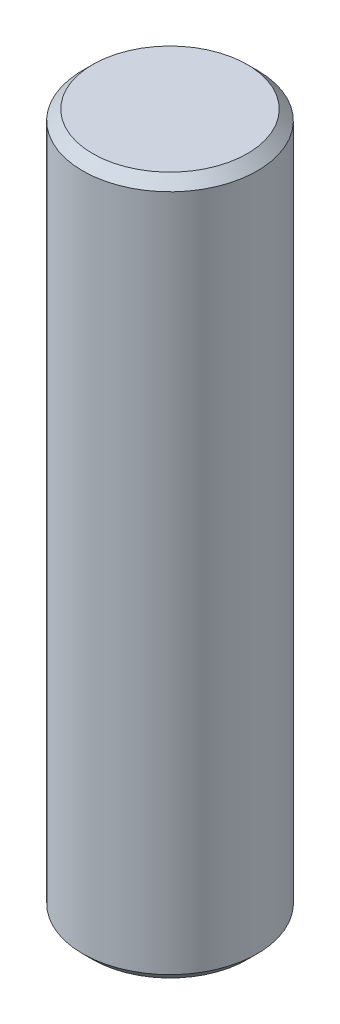
ISO-10303-21;
HEADER;
FILE_DESCRIPTION(('STEP AP214'),'2;1');
FILE_NAME('part.step','',(''),(''),'','','');
FILE_SCHEMA(('AUTOMOTIVE_DESIGN { 1 0 10303 214 1 1 1 1 }'));
ENDSEC;
DATA;
#1=APPLICATION_CONTEXT('core data for automotive mechanical design processes');
#2=APPLICATION_PROTOCOL_DEFINITION('international standard','automotive_design',2000,#1);
#3=PRODUCT_CONTEXT('',#1,'mechanical');
#4=PRODUCT('Part','Part','',(#3));
#5=PRODUCT_RELATED_PRODUCT_CATEGORY('part','',(#4));
#6=PRODUCT_DEFINITION_FORMATION('','',#4);
#7=PRODUCT_DEFINITION_CONTEXT('part definition',#1,'design');
#8=PRODUCT_DEFINITION('design','',#6,#7);
#9=PRODUCT_DEFINITION_SHAPE('','',#8);
#10=(LENGTH_UNIT() NAMED_UNIT(*) SI_UNIT(.MILLI.,.METRE.));
#11=(NAMED_UNIT(*) PLANE_ANGLE_UNIT() SI_UNIT($,.RADIAN.));
#12=(NAMED_UNIT(*) SI_UNIT($,.STERADIAN.) SOLID_ANGLE_UNIT());
#13=UNCERTAINTY_MEASURE_WITH_UNIT(LENGTH_MEASURE(1.E-05),#10,'distance_accuracy_value','');
#14=(GEOMETRIC_REPRESENTATION_CONTEXT(3) GLOBAL_UNCERTAINTY_ASSIGNED_CONTEXT((#13)) GLOBAL_UNIT_ASSIGNED_CONTEXT((#10,
#11,#12)) REPRESENTATION_CONTEXT('',''));
#15=CARTESIAN_POINT('',(0.,0.,0.));
#16=DIRECTION('',(0.,0.,1.));
#17=DIRECTION('',(1.,0.,0.));
#18=AXIS2_PLACEMENT_3D('',#15,#16,#17);
#19=CARTESIAN_POINT('',(0.,14.,0.));
#20=DIRECTION('',(0.,-1.,0.));
#21=DIRECTION('',(0.,0.,-1.));
#22=AXIS2_PLACEMENT_3D('',#19,#20,#21);
#23=CYLINDRICAL_SURFACE('',#22,1.75);
#24=CARTESIAN_POINT('',(0.,0.200000000000002,0.));
#25=DIRECTION('',(0.,1.,0.));
#26=DIRECTION('',(0.,0.,1.));
#27=AXIS2_PLACEMENT_3D('',#24,#25,#26);
#28=CIRCLE('',#27,1.75);
#29=CARTESIAN_POINT('',(0.,0.200000000000002,1.75));
#30=VERTEX_POINT('',#29);
#31=EDGE_CURVE('E46',#30,#30,#28,.T.);
#32=ORIENTED_EDGE('',*,*,#31,.T.);
#33=EDGE_LOOP('',(#32));
#34=FACE_BOUND('',#33,.T.);
#35=CARTESIAN_POINT('',(0.,13.8,0.));
#36=DIRECTION('',(0.,1.,0.));
#37=DIRECTION('',(0.,0.,1.));
#38=AXIS2_PLACEMENT_3D('',#35,#36,#37);
#39=CIRCLE('',#38,1.75);
#40=CARTESIAN_POINT('',(0.,13.8,1.75));
#41=VERTEX_POINT('',#40);
#42=EDGE_CURVE('E50',#41,#41,#39,.F.);
#43=ORIENTED_EDGE('',*,*,#42,.T.);
#44=EDGE_LOOP('',(#43));
#45=FACE_BOUND('',#44,.T.);
#46=ADVANCED_FACE('F34',(#34,#45),#23,.T.);
#47=CARTESIAN_POINT('',(0.,14.,0.));
#48=DIRECTION('',(0.,1.,0.));
#49=DIRECTION('',(0.,0.,1.));
#50=AXIS2_PLACEMENT_3D('',#47,#48,#49);
#51=PLANE('',#50);
#52=CARTESIAN_POINT('',(0.,14.,0.));
#53=DIRECTION('',(0.,1.,0.));
#54=DIRECTION('',(0.,0.,1.));
#55=AXIS2_PLACEMENT_3D('',#52,#53,#54);
#56=CIRCLE('',#55,1.55);
#57=CARTESIAN_POINT('',(0.,14.,1.55));
#58=VERTEX_POINT('',#57);
#59=EDGE_CURVE('E10',#58,#58,#56,.T.);
#60=ORIENTED_EDGE('',*,*,#59,.T.);
#61=EDGE_LOOP('',(#60));
#62=FACE_BOUND('',#61,.T.);
#63=ADVANCED_FACE('F66',(#62),#51,.T.);
#64=CARTESIAN_POINT('',(0.,0.,0.));
#65=DIRECTION('',(0.,1.,0.));
#66=DIRECTION('',(0.,0.,1.));
#67=AXIS2_PLACEMENT_3D('',#64,#65,#66);
#68=PLANE('',#67);
#69=CARTESIAN_POINT('',(0.,0.,0.));
#70=DIRECTION('',(0.,1.,0.));
#71=DIRECTION('',(0.,0.,1.));
#72=AXIS2_PLACEMENT_3D('',#69,#70,#71);
#73=CIRCLE('',#72,1.55);
#74=CARTESIAN_POINT('',(0.,0.,1.55));
#75=VERTEX_POINT('',#74);
#76=EDGE_CURVE('E42',#75,#75,#73,.F.);
#77=ORIENTED_EDGE('',*,*,#76,.T.);
#78=EDGE_LOOP('',(#77));
#79=FACE_BOUND('',#78,.T.);
#80=ADVANCED_FACE('F63',(#79),#68,.F.);
#81=CARTESIAN_POINT('',(0.,0.200000000000002,0.));
#82=DIRECTION('',(0.,1.,0.));
#83=DIRECTION('',(0.,0.,1.));
#84=AXIS2_PLACEMENT_3D('',#81,#82,#83);
#85=CONICAL_SURFACE('',#84,1.75,0.785398163397449);
#86=ORIENTED_EDGE('',*,*,#76,.F.);
#87=EDGE_LOOP('',(#86));
#88=FACE_BOUND('',#87,.T.);
#89=ORIENTED_EDGE('',*,*,#31,.F.);
#90=EDGE_LOOP('',(#89));
#91=FACE_BOUND('',#90,.T.);
#92=ADVANCED_FACE('F59',(#88,#91),#85,.T.);
#93=CARTESIAN_POINT('',(0.,14.,0.));
#94=DIRECTION('',(0.,-1.,0.));
#95=DIRECTION('',(0.,0.,-1.));
#96=AXIS2_PLACEMENT_3D('',#93,#94,#95);
#97=CONICAL_SURFACE('',#96,1.55,0.785398163397449);
#98=ORIENTED_EDGE('',*,*,#42,.F.);
#99=EDGE_LOOP('',(#98));
#100=FACE_BOUND('',#99,.T.);
#101=ORIENTED_EDGE('',*,*,#59,.F.);
#102=EDGE_LOOP('',(#101));
#103=FACE_BOUND('',#102,.T.);
#104=ADVANCED_FACE('F37',(#100,#103),#97,.T.);
#105=CLOSED_SHELL('',(#46,#63,#80,#92,#104));
#106=MANIFOLD_SOLID_BREP('B2',#105);
#107=ADVANCED_BREP_SHAPE_REPRESENTATION('',(#18,#106),#14);
#108=SHAPE_DEFINITION_REPRESENTATION(#9,#107);
ENDSEC;
END-ISO-10303-21;
